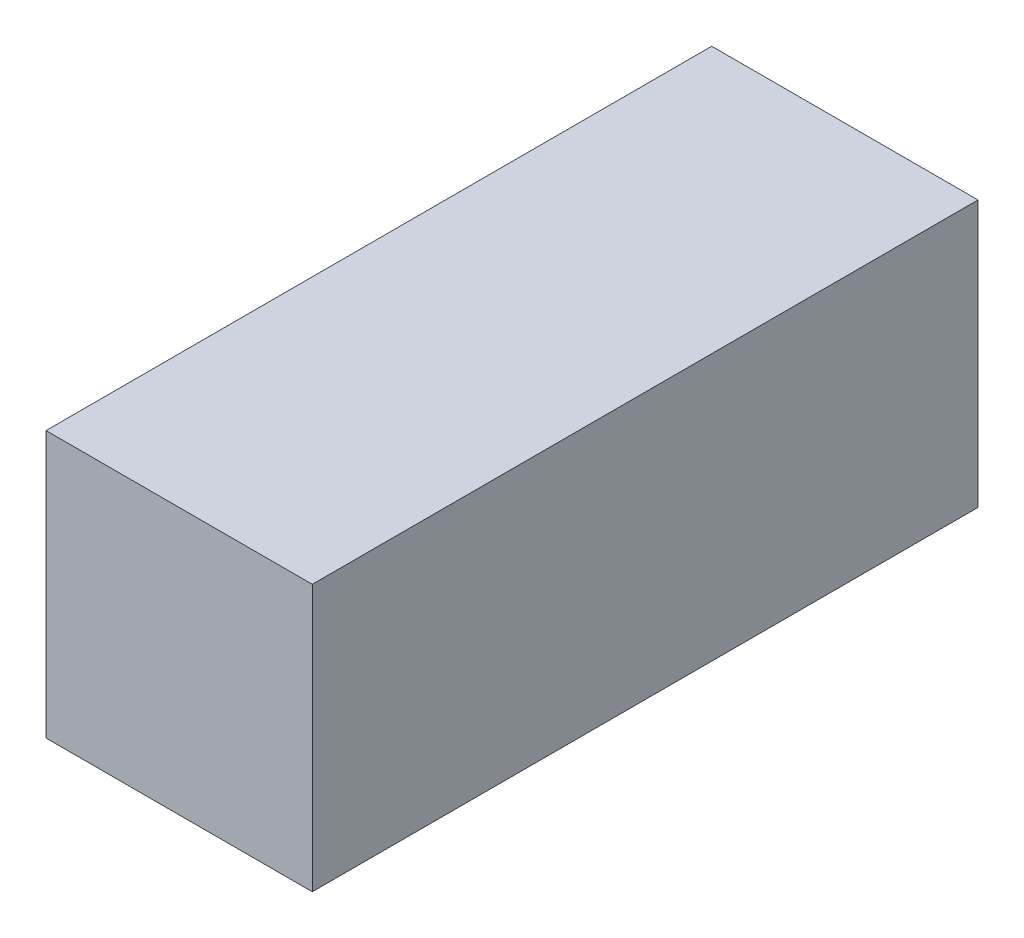
ISO-10303-21;
HEADER;
FILE_DESCRIPTION(('STEP AP214'),'2;1');
FILE_NAME('part.step','',(''),(''),'','','');
FILE_SCHEMA(('AUTOMOTIVE_DESIGN { 1 0 10303 214 1 1 1 1 }'));
ENDSEC;
DATA;
#1=APPLICATION_CONTEXT('core data for automotive mechanical design processes');
#2=APPLICATION_PROTOCOL_DEFINITION('international standard','automotive_design',2000,#1);
#3=PRODUCT_CONTEXT('',#1,'mechanical');
#4=PRODUCT('Part','Part','',(#3));
#5=PRODUCT_RELATED_PRODUCT_CATEGORY('part','',(#4));
#6=PRODUCT_DEFINITION_FORMATION('','',#4);
#7=PRODUCT_DEFINITION_CONTEXT('part definition',#1,'design');
#8=PRODUCT_DEFINITION('design','',#6,#7);
#9=PRODUCT_DEFINITION_SHAPE('','',#8);
#10=(LENGTH_UNIT() NAMED_UNIT(*) SI_UNIT(.MILLI.,.METRE.));
#11=(NAMED_UNIT(*) PLANE_ANGLE_UNIT() SI_UNIT($,.RADIAN.));
#12=(NAMED_UNIT(*) SI_UNIT($,.STERADIAN.) SOLID_ANGLE_UNIT());
#13=UNCERTAINTY_MEASURE_WITH_UNIT(LENGTH_MEASURE(1.E-05),#10,'distance_accuracy_value','');
#14=(GEOMETRIC_REPRESENTATION_CONTEXT(3) GLOBAL_UNCERTAINTY_ASSIGNED_CONTEXT((#13)) GLOBAL_UNIT_ASSIGNED_CONTEXT((#10,
#11,#12)) REPRESENTATION_CONTEXT('',''));
#15=CARTESIAN_POINT('',(0.,0.,0.));
#16=DIRECTION('',(0.,0.,1.));
#17=DIRECTION('',(1.,0.,0.));
#18=AXIS2_PLACEMENT_3D('',#15,#16,#17);
#19=CARTESIAN_POINT('',(0.,0.,500.));
#20=DIRECTION('',(1.,0.,0.));
#21=DIRECTION('',(0.,0.,-1.));
#22=AXIS2_PLACEMENT_3D('',#19,#20,#21);
#23=PLANE('',#22);
#24=DIRECTION('',(0.,-1.,0.));
#25=VECTOR('',#24,1.);
#26=CARTESIAN_POINT('',(0.,0.,0.));
#27=LINE('',#26,#25);
#28=CARTESIAN_POINT('',(0.,200.,0.));
#29=VERTEX_POINT('',#28);
#30=CARTESIAN_POINT('',(0.,0.,0.));
#31=VERTEX_POINT('',#30);
#32=EDGE_CURVE('E96',#29,#31,#27,.T.);
#33=ORIENTED_EDGE('',*,*,#32,.T.);
#34=DIRECTION('',(0.,0.,-1.));
#35=VECTOR('',#34,1.);
#36=CARTESIAN_POINT('',(0.,0.,500.));
#37=LINE('',#36,#35);
#38=CARTESIAN_POINT('',(0.,0.,500.));
#39=VERTEX_POINT('',#38);
#40=EDGE_CURVE('E11',#39,#31,#37,.T.);
#41=ORIENTED_EDGE('',*,*,#40,.F.);
#42=DIRECTION('',(0.,-1.,0.));
#43=VECTOR('',#42,1.);
#44=CARTESIAN_POINT('',(0.,0.,500.));
#45=LINE('',#44,#43);
#46=CARTESIAN_POINT('',(0.,200.,500.));
#47=VERTEX_POINT('',#46);
#48=EDGE_CURVE('E84',#47,#39,#45,.T.);
#49=ORIENTED_EDGE('',*,*,#48,.F.);
#50=DIRECTION('',(0.,0.,-1.));
#51=VECTOR('',#50,1.);
#52=CARTESIAN_POINT('',(0.,200.,500.));
#53=LINE('',#52,#51);
#54=EDGE_CURVE('E92',#47,#29,#53,.T.);
#55=ORIENTED_EDGE('',*,*,#54,.T.);
#56=EDGE_LOOP('',(#33,#41,#49,#55));
#57=FACE_BOUND('',#56,.T.);
#58=ADVANCED_FACE('F33',(#57),#23,.F.);
#59=CARTESIAN_POINT('',(0.,0.,500.));
#60=DIRECTION('',(0.,1.,0.));
#61=DIRECTION('',(0.,0.,1.));
#62=AXIS2_PLACEMENT_3D('',#59,#60,#61);
#63=PLANE('',#62);
#64=DIRECTION('',(1.,0.,0.));
#65=VECTOR('',#64,1.);
#66=CARTESIAN_POINT('',(0.,0.,0.));
#67=LINE('',#66,#65);
#68=CARTESIAN_POINT('',(200.,0.,0.));
#69=VERTEX_POINT('',#68);
#70=EDGE_CURVE('E88',#31,#69,#67,.T.);
#71=ORIENTED_EDGE('',*,*,#70,.T.);
#72=DIRECTION('',(0.,0.,-1.));
#73=VECTOR('',#72,1.);
#74=CARTESIAN_POINT('',(200.,0.,500.));
#75=LINE('',#74,#73);
#76=CARTESIAN_POINT('',(200.,0.,500.));
#77=VERTEX_POINT('',#76);
#78=EDGE_CURVE('E41',#77,#69,#75,.T.);
#79=ORIENTED_EDGE('',*,*,#78,.F.);
#80=DIRECTION('',(1.,0.,0.));
#81=VECTOR('',#80,1.);
#82=CARTESIAN_POINT('',(0.,0.,500.));
#83=LINE('',#82,#81);
#84=EDGE_CURVE('E79',#39,#77,#83,.T.);
#85=ORIENTED_EDGE('',*,*,#84,.F.);
#86=ORIENTED_EDGE('',*,*,#40,.T.);
#87=EDGE_LOOP('',(#71,#79,#85,#86));
#88=FACE_BOUND('',#87,.T.);
#89=ADVANCED_FACE('F87',(#88),#63,.F.);
#90=CARTESIAN_POINT('',(200.,0.,500.));
#91=DIRECTION('',(-1.,0.,0.));
#92=DIRECTION('',(0.,0.,1.));
#93=AXIS2_PLACEMENT_3D('',#90,#91,#92);
#94=PLANE('',#93);
#95=DIRECTION('',(0.,1.,0.));
#96=VECTOR('',#95,1.);
#97=CARTESIAN_POINT('',(200.,0.,0.));
#98=LINE('',#97,#96);
#99=CARTESIAN_POINT('',(200.,200.,0.));
#100=VERTEX_POINT('',#99);
#101=EDGE_CURVE('E66',#69,#100,#98,.T.);
#102=ORIENTED_EDGE('',*,*,#101,.T.);
#103=DIRECTION('',(0.,0.,-1.));
#104=VECTOR('',#103,1.);
#105=CARTESIAN_POINT('',(200.,200.,500.));
#106=LINE('',#105,#104);
#107=CARTESIAN_POINT('',(200.,200.,500.));
#108=VERTEX_POINT('',#107);
#109=EDGE_CURVE('E89',#108,#100,#106,.T.);
#110=ORIENTED_EDGE('',*,*,#109,.F.);
#111=DIRECTION('',(0.,1.,0.));
#112=VECTOR('',#111,1.);
#113=CARTESIAN_POINT('',(200.,0.,500.));
#114=LINE('',#113,#112);
#115=EDGE_CURVE('E82',#77,#108,#114,.T.);
#116=ORIENTED_EDGE('',*,*,#115,.F.);
#117=ORIENTED_EDGE('',*,*,#78,.T.);
#118=EDGE_LOOP('',(#102,#110,#116,#117));
#119=FACE_BOUND('',#118,.T.);
#120=ADVANCED_FACE('F90',(#119),#94,.F.);
#121=CARTESIAN_POINT('',(0.,200.,500.));
#122=DIRECTION('',(0.,-1.,0.));
#123=DIRECTION('',(0.,0.,-1.));
#124=AXIS2_PLACEMENT_3D('',#121,#122,#123);
#125=PLANE('',#124);
#126=DIRECTION('',(-1.,0.,0.));
#127=VECTOR('',#126,1.);
#128=CARTESIAN_POINT('',(0.,200.,0.));
#129=LINE('',#128,#127);
#130=EDGE_CURVE('E72',#100,#29,#129,.T.);
#131=ORIENTED_EDGE('',*,*,#130,.T.);
#132=ORIENTED_EDGE('',*,*,#54,.F.);
#133=DIRECTION('',(-1.,0.,0.));
#134=VECTOR('',#133,1.);
#135=CARTESIAN_POINT('',(0.,200.,500.));
#136=LINE('',#135,#134);
#137=EDGE_CURVE('E49',#108,#47,#136,.T.);
#138=ORIENTED_EDGE('',*,*,#137,.F.);
#139=ORIENTED_EDGE('',*,*,#109,.T.);
#140=EDGE_LOOP('',(#131,#132,#138,#139));
#141=FACE_BOUND('',#140,.T.);
#142=ADVANCED_FACE('F103',(#141),#125,.F.);
#143=CARTESIAN_POINT('',(0.,0.,500.));
#144=DIRECTION('',(0.,0.,-1.));
#145=DIRECTION('',(-1.,0.,0.));
#146=AXIS2_PLACEMENT_3D('',#143,#144,#145);
#147=PLANE('',#146);
#148=ORIENTED_EDGE('',*,*,#48,.T.);
#149=ORIENTED_EDGE('',*,*,#84,.T.);
#150=ORIENTED_EDGE('',*,*,#115,.T.);
#151=ORIENTED_EDGE('',*,*,#137,.T.);
#152=EDGE_LOOP('',(#148,#149,#150,#151));
#153=FACE_BOUND('',#152,.T.);
#154=ADVANCED_FACE('F80',(#153),#147,.F.);
#155=CARTESIAN_POINT('',(0.,0.,0.));
#156=DIRECTION('',(0.,0.,-1.));
#157=DIRECTION('',(-1.,0.,0.));
#158=AXIS2_PLACEMENT_3D('',#155,#156,#157);
#159=PLANE('',#158);
#160=ORIENTED_EDGE('',*,*,#32,.F.);
#161=ORIENTED_EDGE('',*,*,#130,.F.);
#162=ORIENTED_EDGE('',*,*,#101,.F.);
#163=ORIENTED_EDGE('',*,*,#70,.F.);
#164=EDGE_LOOP('',(#160,#161,#162,#163));
#165=FACE_BOUND('',#164,.T.);
#166=ADVANCED_FACE('F106',(#165),#159,.T.);
#167=CLOSED_SHELL('',(#58,#89,#120,#142,#154,#166));
#168=MANIFOLD_SOLID_BREP('B2',#167);
#169=ADVANCED_BREP_SHAPE_REPRESENTATION('',(#18,#168),#14);
#170=SHAPE_DEFINITION_REPRESENTATION(#9,#169);
ENDSEC;
END-ISO-10303-21;
